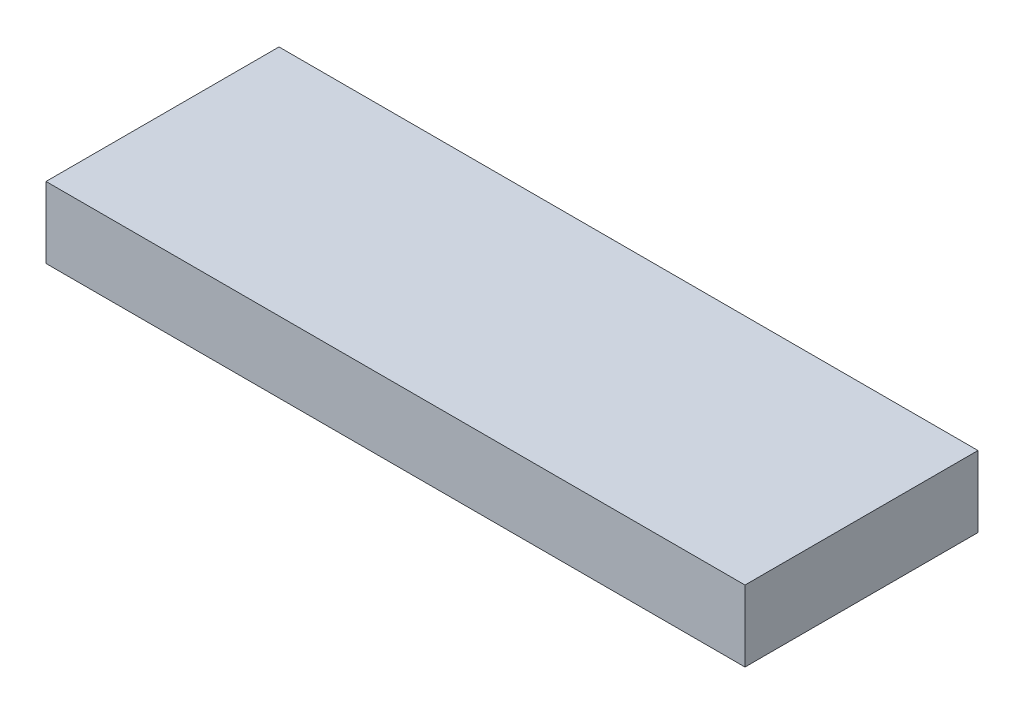
ISO-10303-21;
HEADER;
FILE_DESCRIPTION(('STEP AP214'),'2;1');
FILE_NAME('part.step','',(''),(''),'','','');
FILE_SCHEMA(('AUTOMOTIVE_DESIGN { 1 0 10303 214 1 1 1 1 }'));
ENDSEC;
DATA;
#1=APPLICATION_CONTEXT('core data for automotive mechanical design processes');
#2=APPLICATION_PROTOCOL_DEFINITION('international standard','automotive_design',2000,#1);
#3=PRODUCT_CONTEXT('',#1,'mechanical');
#4=PRODUCT('Part','Part','',(#3));
#5=PRODUCT_RELATED_PRODUCT_CATEGORY('part','',(#4));
#6=PRODUCT_DEFINITION_FORMATION('','',#4);
#7=PRODUCT_DEFINITION_CONTEXT('part definition',#1,'design');
#8=PRODUCT_DEFINITION('design','',#6,#7);
#9=PRODUCT_DEFINITION_SHAPE('','',#8);
#10=(LENGTH_UNIT() NAMED_UNIT(*) SI_UNIT(.MILLI.,.METRE.));
#11=(NAMED_UNIT(*) PLANE_ANGLE_UNIT() SI_UNIT($,.RADIAN.));
#12=(NAMED_UNIT(*) SI_UNIT($,.STERADIAN.) SOLID_ANGLE_UNIT());
#13=UNCERTAINTY_MEASURE_WITH_UNIT(LENGTH_MEASURE(1.E-05),#10,'distance_accuracy_value','');
#14=(GEOMETRIC_REPRESENTATION_CONTEXT(3) GLOBAL_UNCERTAINTY_ASSIGNED_CONTEXT((#13)) GLOBAL_UNIT_ASSIGNED_CONTEXT((#10,
#11,#12)) REPRESENTATION_CONTEXT('',''));
#15=CARTESIAN_POINT('',(0.,0.,0.));
#16=DIRECTION('',(0.,0.,1.));
#17=DIRECTION('',(1.,0.,0.));
#18=AXIS2_PLACEMENT_3D('',#15,#16,#17);
#19=CARTESIAN_POINT('',(0.,7.747,0.));
#20=DIRECTION('',(1.,0.,0.));
#21=DIRECTION('',(0.,0.,-1.));
#22=AXIS2_PLACEMENT_3D('',#19,#20,#21);
#23=PLANE('',#22);
#24=DIRECTION('',(0.,0.,1.));
#25=VECTOR('',#24,1.);
#26=CARTESIAN_POINT('',(0.,0.,0.));
#27=LINE('',#26,#25);
#28=CARTESIAN_POINT('',(0.,0.,-25.4));
#29=VERTEX_POINT('',#28);
#30=CARTESIAN_POINT('',(0.,0.,0.));
#31=VERTEX_POINT('',#30);
#32=EDGE_CURVE('E96',#29,#31,#27,.T.);
#33=ORIENTED_EDGE('',*,*,#32,.T.);
#34=DIRECTION('',(0.,-1.,0.));
#35=VECTOR('',#34,1.);
#36=CARTESIAN_POINT('',(0.,7.747,0.));
#37=LINE('',#36,#35);
#38=CARTESIAN_POINT('',(0.,7.747,0.));
#39=VERTEX_POINT('',#38);
#40=EDGE_CURVE('E11',#39,#31,#37,.T.);
#41=ORIENTED_EDGE('',*,*,#40,.F.);
#42=DIRECTION('',(0.,0.,1.));
#43=VECTOR('',#42,1.);
#44=CARTESIAN_POINT('',(0.,7.747,0.));
#45=LINE('',#44,#43);
#46=CARTESIAN_POINT('',(0.,7.747,-25.4));
#47=VERTEX_POINT('',#46);
#48=EDGE_CURVE('E84',#47,#39,#45,.T.);
#49=ORIENTED_EDGE('',*,*,#48,.F.);
#50=DIRECTION('',(0.,-1.,0.));
#51=VECTOR('',#50,1.);
#52=CARTESIAN_POINT('',(0.,7.747,-25.4));
#53=LINE('',#52,#51);
#54=EDGE_CURVE('E92',#47,#29,#53,.T.);
#55=ORIENTED_EDGE('',*,*,#54,.T.);
#56=EDGE_LOOP('',(#33,#41,#49,#55));
#57=FACE_BOUND('',#56,.T.);
#58=ADVANCED_FACE('F33',(#57),#23,.F.);
#59=CARTESIAN_POINT('',(0.,7.747,0.));
#60=DIRECTION('',(0.,0.,-1.));
#61=DIRECTION('',(-1.,0.,0.));
#62=AXIS2_PLACEMENT_3D('',#59,#60,#61);
#63=PLANE('',#62);
#64=DIRECTION('',(1.,0.,0.));
#65=VECTOR('',#64,1.);
#66=CARTESIAN_POINT('',(0.,0.,0.));
#67=LINE('',#66,#65);
#68=CARTESIAN_POINT('',(76.2,0.,0.));
#69=VERTEX_POINT('',#68);
#70=EDGE_CURVE('E88',#31,#69,#67,.T.);
#71=ORIENTED_EDGE('',*,*,#70,.T.);
#72=DIRECTION('',(0.,-1.,0.));
#73=VECTOR('',#72,1.);
#74=CARTESIAN_POINT('',(76.2,7.747,0.));
#75=LINE('',#74,#73);
#76=CARTESIAN_POINT('',(76.2,7.747,0.));
#77=VERTEX_POINT('',#76);
#78=EDGE_CURVE('E41',#77,#69,#75,.T.);
#79=ORIENTED_EDGE('',*,*,#78,.F.);
#80=DIRECTION('',(1.,0.,0.));
#81=VECTOR('',#80,1.);
#82=CARTESIAN_POINT('',(0.,7.747,0.));
#83=LINE('',#82,#81);
#84=EDGE_CURVE('E79',#39,#77,#83,.T.);
#85=ORIENTED_EDGE('',*,*,#84,.F.);
#86=ORIENTED_EDGE('',*,*,#40,.T.);
#87=EDGE_LOOP('',(#71,#79,#85,#86));
#88=FACE_BOUND('',#87,.T.);
#89=ADVANCED_FACE('F87',(#88),#63,.F.);
#90=CARTESIAN_POINT('',(76.2,7.747,0.));
#91=DIRECTION('',(-1.,0.,0.));
#92=DIRECTION('',(0.,0.,1.));
#93=AXIS2_PLACEMENT_3D('',#90,#91,#92);
#94=PLANE('',#93);
#95=DIRECTION('',(0.,0.,-1.));
#96=VECTOR('',#95,1.);
#97=CARTESIAN_POINT('',(76.2,0.,0.));
#98=LINE('',#97,#96);
#99=CARTESIAN_POINT('',(76.2,0.,-25.4));
#100=VERTEX_POINT('',#99);
#101=EDGE_CURVE('E66',#69,#100,#98,.T.);
#102=ORIENTED_EDGE('',*,*,#101,.T.);
#103=DIRECTION('',(0.,-1.,0.));
#104=VECTOR('',#103,1.);
#105=CARTESIAN_POINT('',(76.2,7.747,-25.4));
#106=LINE('',#105,#104);
#107=CARTESIAN_POINT('',(76.2,7.747,-25.4));
#108=VERTEX_POINT('',#107);
#109=EDGE_CURVE('E89',#108,#100,#106,.T.);
#110=ORIENTED_EDGE('',*,*,#109,.F.);
#111=DIRECTION('',(0.,0.,-1.));
#112=VECTOR('',#111,1.);
#113=CARTESIAN_POINT('',(76.2,7.747,0.));
#114=LINE('',#113,#112);
#115=EDGE_CURVE('E82',#77,#108,#114,.T.);
#116=ORIENTED_EDGE('',*,*,#115,.F.);
#117=ORIENTED_EDGE('',*,*,#78,.T.);
#118=EDGE_LOOP('',(#102,#110,#116,#117));
#119=FACE_BOUND('',#118,.T.);
#120=ADVANCED_FACE('F90',(#119),#94,.F.);
#121=CARTESIAN_POINT('',(0.,7.747,-25.4));
#122=DIRECTION('',(0.,0.,1.));
#123=DIRECTION('',(1.,0.,0.));
#124=AXIS2_PLACEMENT_3D('',#121,#122,#123);
#125=PLANE('',#124);
#126=DIRECTION('',(-1.,0.,0.));
#127=VECTOR('',#126,1.);
#128=CARTESIAN_POINT('',(0.,0.,-25.4));
#129=LINE('',#128,#127);
#130=EDGE_CURVE('E72',#100,#29,#129,.T.);
#131=ORIENTED_EDGE('',*,*,#130,.T.);
#132=ORIENTED_EDGE('',*,*,#54,.F.);
#133=DIRECTION('',(-1.,0.,0.));
#134=VECTOR('',#133,1.);
#135=CARTESIAN_POINT('',(0.,7.747,-25.4));
#136=LINE('',#135,#134);
#137=EDGE_CURVE('E49',#108,#47,#136,.T.);
#138=ORIENTED_EDGE('',*,*,#137,.F.);
#139=ORIENTED_EDGE('',*,*,#109,.T.);
#140=EDGE_LOOP('',(#131,#132,#138,#139));
#141=FACE_BOUND('',#140,.T.);
#142=ADVANCED_FACE('F103',(#141),#125,.F.);
#143=CARTESIAN_POINT('',(0.,7.747,0.));
#144=DIRECTION('',(0.,-1.,0.));
#145=DIRECTION('',(0.,0.,-1.));
#146=AXIS2_PLACEMENT_3D('',#143,#144,#145);
#147=PLANE('',#146);
#148=ORIENTED_EDGE('',*,*,#48,.T.);
#149=ORIENTED_EDGE('',*,*,#84,.T.);
#150=ORIENTED_EDGE('',*,*,#115,.T.);
#151=ORIENTED_EDGE('',*,*,#137,.T.);
#152=EDGE_LOOP('',(#148,#149,#150,#151));
#153=FACE_BOUND('',#152,.T.);
#154=ADVANCED_FACE('F80',(#153),#147,.F.);
#155=CARTESIAN_POINT('',(0.,0.,0.));
#156=DIRECTION('',(0.,-1.,0.));
#157=DIRECTION('',(0.,0.,-1.));
#158=AXIS2_PLACEMENT_3D('',#155,#156,#157);
#159=PLANE('',#158);
#160=ORIENTED_EDGE('',*,*,#32,.F.);
#161=ORIENTED_EDGE('',*,*,#130,.F.);
#162=ORIENTED_EDGE('',*,*,#101,.F.);
#163=ORIENTED_EDGE('',*,*,#70,.F.);
#164=EDGE_LOOP('',(#160,#161,#162,#163));
#165=FACE_BOUND('',#164,.T.);
#166=ADVANCED_FACE('F106',(#165),#159,.T.);
#167=CLOSED_SHELL('',(#58,#89,#120,#142,#154,#166));
#168=MANIFOLD_SOLID_BREP('B2',#167);
#169=ADVANCED_BREP_SHAPE_REPRESENTATION('',(#18,#168),#14);
#170=SHAPE_DEFINITION_REPRESENTATION(#9,#169);
ENDSEC;
END-ISO-10303-21;
